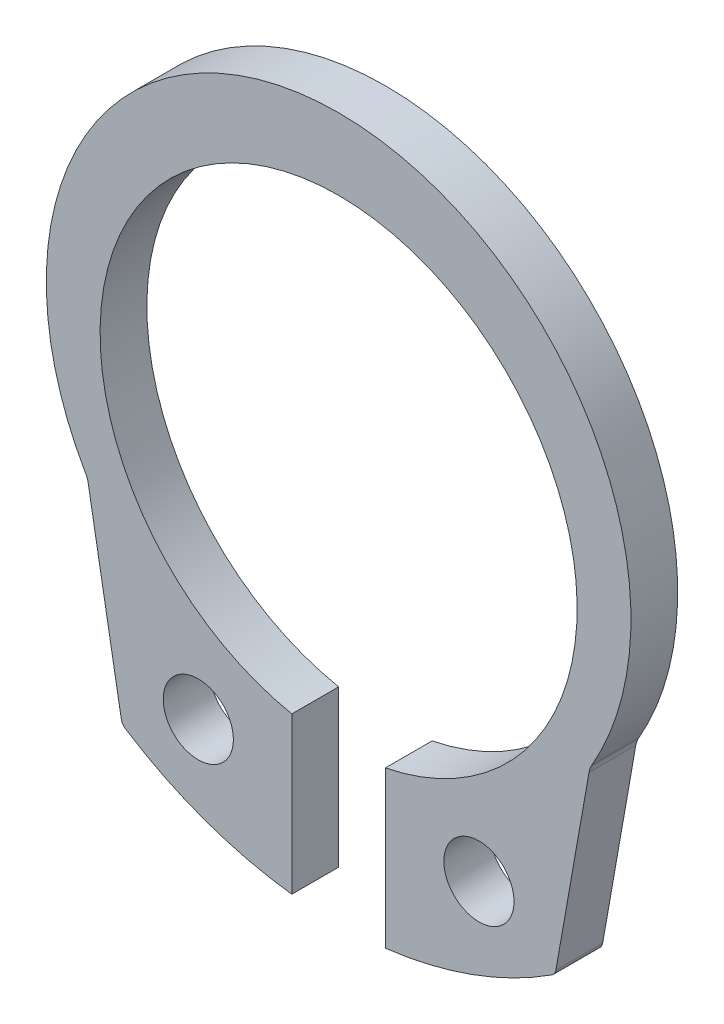
ISO-10303-21;
HEADER;
FILE_DESCRIPTION(('STEP AP214'),'2;1');
FILE_NAME('part.step','',(''),(''),'','','');
FILE_SCHEMA(('AUTOMOTIVE_DESIGN { 1 0 10303 214 1 1 1 1 }'));
ENDSEC;
DATA;
#1=APPLICATION_CONTEXT('core data for automotive mechanical design processes');
#2=APPLICATION_PROTOCOL_DEFINITION('international standard','automotive_design',2000,#1);
#3=PRODUCT_CONTEXT('',#1,'mechanical');
#4=PRODUCT('Part','Part','',(#3));
#5=PRODUCT_RELATED_PRODUCT_CATEGORY('part','',(#4));
#6=PRODUCT_DEFINITION_FORMATION('','',#4);
#7=PRODUCT_DEFINITION_CONTEXT('part definition',#1,'design');
#8=PRODUCT_DEFINITION('design','',#6,#7);
#9=PRODUCT_DEFINITION_SHAPE('','',#8);
#10=(LENGTH_UNIT() NAMED_UNIT(*) SI_UNIT(.MILLI.,.METRE.));
#11=(NAMED_UNIT(*) PLANE_ANGLE_UNIT() SI_UNIT($,.RADIAN.));
#12=(NAMED_UNIT(*) SI_UNIT($,.STERADIAN.) SOLID_ANGLE_UNIT());
#13=UNCERTAINTY_MEASURE_WITH_UNIT(LENGTH_MEASURE(1.E-05),#10,'distance_accuracy_value','');
#14=(GEOMETRIC_REPRESENTATION_CONTEXT(3) GLOBAL_UNCERTAINTY_ASSIGNED_CONTEXT((#13)) GLOBAL_UNIT_ASSIGNED_CONTEXT((#10,
#11,#12)) REPRESENTATION_CONTEXT('',''));
#15=CARTESIAN_POINT('',(0.,0.,0.));
#16=DIRECTION('',(0.,0.,1.));
#17=DIRECTION('',(1.,0.,0.));
#18=AXIS2_PLACEMENT_3D('',#15,#16,#17);
#19=CARTESIAN_POINT('',(0.,-0.38,-1.));
#20=DIRECTION('',(0.,0.,1.));
#21=DIRECTION('',(1.,0.,0.));
#22=AXIS2_PLACEMENT_3D('',#19,#20,#21);
#23=CYLINDRICAL_SURFACE('',#22,8.4);
#24=CARTESIAN_POINT('',(0.,-0.38,-1.));
#25=DIRECTION('',(0.,0.,1.));
#26=DIRECTION('',(-1.,0.,0.));
#27=AXIS2_PLACEMENT_3D('',#24,#25,#26);
#28=CIRCLE('',#27,8.4);
#29=CARTESIAN_POINT('',(1.,-8.72026378479722,-1.));
#30=VERTEX_POINT('',#29);
#31=CARTESIAN_POINT('',(4.55722248296453,-7.43632505209069,-1.));
#32=VERTEX_POINT('',#31);
#33=EDGE_CURVE('E174',#30,#32,#28,.T.);
#34=ORIENTED_EDGE('',*,*,#33,.T.);
#35=DIRECTION('',(0.,0.,1.));
#36=VECTOR('',#35,1.);
#37=CARTESIAN_POINT('',(4.55722248296453,-7.43632505209069,-1.));
#38=LINE('',#37,#36);
#39=CARTESIAN_POINT('',(4.55722248296453,-7.43632505209069,0.));
#40=VERTEX_POINT('',#39);
#41=EDGE_CURVE('E192',#32,#40,#38,.T.);
#42=ORIENTED_EDGE('',*,*,#41,.T.);
#43=CARTESIAN_POINT('',(0.,-0.38,0.));
#44=DIRECTION('',(0.,0.,1.));
#45=DIRECTION('',(-1.,0.,0.));
#46=AXIS2_PLACEMENT_3D('',#43,#44,#45);
#47=CIRCLE('',#46,8.4);
#48=CARTESIAN_POINT('',(1.,-8.72026378479722,0.));
#49=VERTEX_POINT('',#48);
#50=EDGE_CURVE('E154',#49,#40,#47,.T.);
#51=ORIENTED_EDGE('',*,*,#50,.F.);
#52=DIRECTION('',(0.,0.,1.));
#53=VECTOR('',#52,1.);
#54=CARTESIAN_POINT('',(1.,-8.72026378479722,-1.));
#55=LINE('',#54,#53);
#56=EDGE_CURVE('E175',#30,#49,#55,.T.);
#57=ORIENTED_EDGE('',*,*,#56,.F.);
#58=EDGE_LOOP('',(#34,#42,#51,#57));
#59=FACE_BOUND('',#58,.T.);
#60=ADVANCED_FACE('F33',(#59),#23,.T.);
#61=CARTESIAN_POINT('',(1.,-5.38099990001999,-1.));
#62=DIRECTION('',(-1.,0.,0.));
#63=DIRECTION('',(0.,-1.,0.));
#64=AXIS2_PLACEMENT_3D('',#61,#62,#63);
#65=PLANE('',#64);
#66=DIRECTION('',(0.,-1.,0.));
#67=VECTOR('',#66,1.);
#68=CARTESIAN_POINT('',(1.,-5.38099990001999,0.));
#69=LINE('',#68,#67);
#70=CARTESIAN_POINT('',(1.,-5.38099990001999,0.));
#71=VERTEX_POINT('',#70);
#72=EDGE_CURVE('E171',#71,#49,#69,.T.);
#73=ORIENTED_EDGE('',*,*,#72,.F.);
#74=DIRECTION('',(0.,0.,1.));
#75=VECTOR('',#74,1.);
#76=CARTESIAN_POINT('',(1.,-5.38099990001999,-1.));
#77=LINE('',#76,#75);
#78=CARTESIAN_POINT('',(1.,-5.38099990001999,-1.));
#79=VERTEX_POINT('',#78);
#80=EDGE_CURVE('E178',#79,#71,#77,.T.);
#81=ORIENTED_EDGE('',*,*,#80,.F.);
#82=DIRECTION('',(0.,-1.,0.));
#83=VECTOR('',#82,1.);
#84=CARTESIAN_POINT('',(1.,-5.38099990001999,-1.));
#85=LINE('',#84,#83);
#86=EDGE_CURVE('E141',#79,#30,#85,.T.);
#87=ORIENTED_EDGE('',*,*,#86,.T.);
#88=ORIENTED_EDGE('',*,*,#56,.T.);
#89=EDGE_LOOP('',(#73,#81,#87,#88));
#90=FACE_BOUND('',#89,.T.);
#91=ADVANCED_FACE('F273',(#90),#65,.T.);
#92=CARTESIAN_POINT('',(0.,-0.38,-1.));
#93=DIRECTION('',(0.,0.,1.));
#94=DIRECTION('',(1.,0.,0.));
#95=AXIS2_PLACEMENT_3D('',#92,#93,#94);
#96=CYLINDRICAL_SURFACE('',#95,5.1);
#97=CARTESIAN_POINT('',(0.,-0.38,0.));
#98=DIRECTION('',(0.,0.,-1.));
#99=DIRECTION('',(1.,0.,0.));
#100=AXIS2_PLACEMENT_3D('',#97,#98,#99);
#101=CIRCLE('',#100,5.1);
#102=CARTESIAN_POINT('',(-1.,-5.38099990001999,0.));
#103=VERTEX_POINT('',#102);
#104=EDGE_CURVE('E168',#103,#71,#101,.T.);
#105=ORIENTED_EDGE('',*,*,#104,.F.);
#106=DIRECTION('',(0.,0.,1.));
#107=VECTOR('',#106,1.);
#108=CARTESIAN_POINT('',(-1.,-5.38099990001999,-1.));
#109=LINE('',#108,#107);
#110=CARTESIAN_POINT('',(-1.,-5.38099990001999,-1.));
#111=VERTEX_POINT('',#110);
#112=EDGE_CURVE('E140',#111,#103,#109,.T.);
#113=ORIENTED_EDGE('',*,*,#112,.F.);
#114=CARTESIAN_POINT('',(0.,-0.38,-1.));
#115=DIRECTION('',(0.,0.,-1.));
#116=DIRECTION('',(1.,0.,0.));
#117=AXIS2_PLACEMENT_3D('',#114,#115,#116);
#118=CIRCLE('',#117,5.1);
#119=EDGE_CURVE('E147',#111,#79,#118,.T.);
#120=ORIENTED_EDGE('',*,*,#119,.T.);
#121=ORIENTED_EDGE('',*,*,#80,.T.);
#122=EDGE_LOOP('',(#105,#113,#120,#121));
#123=FACE_BOUND('',#122,.T.);
#124=ADVANCED_FACE('F279',(#123),#96,.F.);
#125=CARTESIAN_POINT('',(-1.,-5.38099990001999,-1.));
#126=DIRECTION('',(1.,0.,0.));
#127=DIRECTION('',(0.,1.,0.));
#128=AXIS2_PLACEMENT_3D('',#125,#126,#127);
#129=PLANE('',#128);
#130=DIRECTION('',(0.,1.,0.));
#131=VECTOR('',#130,1.);
#132=CARTESIAN_POINT('',(-1.,-5.38099990001999,0.));
#133=LINE('',#132,#131);
#134=CARTESIAN_POINT('',(-1.,-8.72026378479722,0.));
#135=VERTEX_POINT('',#134);
#136=EDGE_CURVE('E139',#135,#103,#133,.T.);
#137=ORIENTED_EDGE('',*,*,#136,.F.);
#138=DIRECTION('',(0.,0.,1.));
#139=VECTOR('',#138,1.);
#140=CARTESIAN_POINT('',(-1.,-8.72026378479722,-1.));
#141=LINE('',#140,#139);
#142=CARTESIAN_POINT('',(-1.,-8.72026378479722,-1.));
#143=VERTEX_POINT('',#142);
#144=EDGE_CURVE('E124',#143,#135,#141,.T.);
#145=ORIENTED_EDGE('',*,*,#144,.F.);
#146=DIRECTION('',(0.,1.,0.));
#147=VECTOR('',#146,1.);
#148=CARTESIAN_POINT('',(-1.,-5.38099990001999,-1.));
#149=LINE('',#148,#147);
#150=EDGE_CURVE('E132',#143,#111,#149,.T.);
#151=ORIENTED_EDGE('',*,*,#150,.T.);
#152=ORIENTED_EDGE('',*,*,#112,.T.);
#153=EDGE_LOOP('',(#137,#145,#151,#152));
#154=FACE_BOUND('',#153,.T.);
#155=ADVANCED_FACE('F137',(#154),#129,.T.);
#156=CARTESIAN_POINT('',(0.,-0.38,-1.));
#157=DIRECTION('',(0.,0.,1.));
#158=DIRECTION('',(1.,0.,0.));
#159=AXIS2_PLACEMENT_3D('',#156,#157,#158);
#160=CYLINDRICAL_SURFACE('',#159,8.4);
#161=CARTESIAN_POINT('',(0.,-0.38,0.));
#162=DIRECTION('',(0.,0.,1.));
#163=DIRECTION('',(1.,0.,0.));
#164=AXIS2_PLACEMENT_3D('',#161,#162,#163);
#165=CIRCLE('',#164,8.4);
#166=CARTESIAN_POINT('',(-4.55722248296453,-7.43632505209069,0.));
#167=VERTEX_POINT('',#166);
#168=EDGE_CURVE('E165',#167,#135,#165,.T.);
#169=ORIENTED_EDGE('',*,*,#168,.F.);
#170=DIRECTION('',(0.,0.,1.));
#171=VECTOR('',#170,1.);
#172=CARTESIAN_POINT('',(-4.55722248296453,-7.43632505209069,-1.));
#173=LINE('',#172,#171);
#174=CARTESIAN_POINT('',(-4.55722248296453,-7.43632505209069,-1.));
#175=VERTEX_POINT('',#174);
#176=EDGE_CURVE('E127',#167,#175,#173,.F.);
#177=ORIENTED_EDGE('',*,*,#176,.T.);
#178=CARTESIAN_POINT('',(0.,-0.38,-1.));
#179=DIRECTION('',(0.,0.,1.));
#180=DIRECTION('',(1.,0.,0.));
#181=AXIS2_PLACEMENT_3D('',#178,#179,#180);
#182=CIRCLE('',#181,8.4);
#183=EDGE_CURVE('E120',#175,#143,#182,.T.);
#184=ORIENTED_EDGE('',*,*,#183,.T.);
#185=ORIENTED_EDGE('',*,*,#144,.T.);
#186=EDGE_LOOP('',(#169,#177,#184,#185));
#187=FACE_BOUND('',#186,.T.);
#188=ADVANCED_FACE('F123',(#187),#160,.T.);
#189=CARTESIAN_POINT('',(-5.36936571907662,-3.19881412007713,-1.));
#190=DIRECTION('',(-0.984807753012208,-0.173648177666931,0.));
#191=DIRECTION('',(0.173648177666931,-0.984807753012208,0.));
#192=AXIS2_PLACEMENT_3D('',#189,#190,#191);
#193=PLANE('',#192);
#194=DIRECTION('',(0.173648177666931,-0.984807753012208,0.));
#195=VECTOR('',#194,1.);
#196=CARTESIAN_POINT('',(-5.36936571907662,-3.19881412007713,0.));
#197=LINE('',#196,#195);
#198=CARTESIAN_POINT('',(-5.3537588947958,-3.28732481888292,0.));
#199=VERTEX_POINT('',#198);
#200=CARTESIAN_POINT('',(-4.64567873635353,-7.30304694828858,0.));
#201=VERTEX_POINT('',#200);
#202=EDGE_CURVE('E163',#199,#201,#197,.T.);
#203=ORIENTED_EDGE('',*,*,#202,.F.);
#204=DIRECTION('',(0.,0.,-1.));
#205=VECTOR('',#204,1.);
#206=CARTESIAN_POINT('',(-5.3537588947958,-3.28732481888292,-1.));
#207=LINE('',#206,#205);
#208=CARTESIAN_POINT('',(-5.3537588947958,-3.28732481888292,-1.));
#209=VERTEX_POINT('',#208);
#210=EDGE_CURVE('E54',#199,#209,#207,.T.);
#211=ORIENTED_EDGE('',*,*,#210,.T.);
#212=DIRECTION('',(0.173648177666931,-0.984807753012208,0.));
#213=VECTOR('',#212,1.);
#214=CARTESIAN_POINT('',(-5.36936571907662,-3.19881412007713,-1.));
#215=LINE('',#214,#213);
#216=CARTESIAN_POINT('',(-4.64567873635353,-7.30304694828858,-1.));
#217=VERTEX_POINT('',#216);
#218=EDGE_CURVE('E133',#209,#217,#215,.T.);
#219=ORIENTED_EDGE('',*,*,#218,.T.);
#220=DIRECTION('',(0.,0.,1.));
#221=VECTOR('',#220,1.);
#222=CARTESIAN_POINT('',(-4.64567873635353,-7.30304694828858,-1.));
#223=LINE('',#222,#221);
#224=EDGE_CURVE('E177',#217,#201,#223,.T.);
#225=ORIENTED_EDGE('',*,*,#224,.T.);
#226=EDGE_LOOP('',(#203,#211,#219,#225));
#227=FACE_BOUND('',#226,.T.);
#228=ADVANCED_FACE('F332',(#227),#193,.T.);
#229=CARTESIAN_POINT('',(0.,0.,-1.));
#230=DIRECTION('',(0.,0.,1.));
#231=DIRECTION('',(1.,0.,0.));
#232=AXIS2_PLACEMENT_3D('',#229,#230,#231);
#233=CYLINDRICAL_SURFACE('',#232,6.25);
#234=CARTESIAN_POINT('',(0.,0.,0.));
#235=DIRECTION('',(0.,0.,1.));
#236=DIRECTION('',(1.,0.,0.));
#237=AXIS2_PLACEMENT_3D('',#234,#235,#236);
#238=CIRCLE('',#237,6.25);
#239=CARTESIAN_POINT('',(5.41311367713139,-3.12421195158925,0.));
#240=VERTEX_POINT('',#239);
#241=CARTESIAN_POINT('',(-5.41311367713139,-3.12421195158925,0.));
#242=VERTEX_POINT('',#241);
#243=EDGE_CURVE('E161',#240,#242,#238,.T.);
#244=ORIENTED_EDGE('',*,*,#243,.F.);
#245=DIRECTION('',(0.,0.,1.));
#246=VECTOR('',#245,1.);
#247=CARTESIAN_POINT('',(5.41311367713139,-3.12421195158925,-1.));
#248=LINE('',#247,#246);
#249=CARTESIAN_POINT('',(5.41311367713139,-3.12421195158925,-1.));
#250=VERTEX_POINT('',#249);
#251=EDGE_CURVE('E203',#240,#250,#248,.F.);
#252=ORIENTED_EDGE('',*,*,#251,.T.);
#253=CARTESIAN_POINT('',(0.,0.,-1.));
#254=DIRECTION('',(0.,0.,1.));
#255=DIRECTION('',(1.,0.,0.));
#256=AXIS2_PLACEMENT_3D('',#253,#254,#255);
#257=CIRCLE('',#256,6.25);
#258=CARTESIAN_POINT('',(-5.41311367713139,-3.12421195158925,-1.));
#259=VERTEX_POINT('',#258);
#260=EDGE_CURVE('E216',#250,#259,#257,.T.);
#261=ORIENTED_EDGE('',*,*,#260,.T.);
#262=DIRECTION('',(0.,0.,1.));
#263=VECTOR('',#262,1.);
#264=CARTESIAN_POINT('',(-5.41311367713139,-3.12421195158925,-1.));
#265=LINE('',#264,#263);
#266=EDGE_CURVE('E200',#259,#242,#265,.T.);
#267=ORIENTED_EDGE('',*,*,#266,.T.);
#268=EDGE_LOOP('',(#244,#252,#261,#267));
#269=FACE_BOUND('',#268,.T.);
#270=ADVANCED_FACE('F229',(#269),#233,.T.);
#271=CARTESIAN_POINT('',(5.36936571907662,-3.19881412007713,-1.));
#272=DIRECTION('',(0.984807753012208,-0.173648177666931,0.));
#273=DIRECTION('',(0.173648177666931,0.984807753012208,0.));
#274=AXIS2_PLACEMENT_3D('',#271,#272,#273);
#275=PLANE('',#274);
#276=DIRECTION('',(0.173648177666931,0.984807753012208,0.));
#277=VECTOR('',#276,1.);
#278=CARTESIAN_POINT('',(5.36936571907662,-3.19881412007713,-1.));
#279=LINE('',#278,#277);
#280=CARTESIAN_POINT('',(4.64567873635353,-7.30304694828858,-1.));
#281=VERTEX_POINT('',#280);
#282=CARTESIAN_POINT('',(5.3537588947958,-3.28732481888292,-1.));
#283=VERTEX_POINT('',#282);
#284=EDGE_CURVE('E213',#281,#283,#279,.T.);
#285=ORIENTED_EDGE('',*,*,#284,.T.);
#286=DIRECTION('',(0.,0.,-1.));
#287=VECTOR('',#286,1.);
#288=CARTESIAN_POINT('',(5.3537588947958,-3.28732481888292,0.));
#289=LINE('',#288,#287);
#290=CARTESIAN_POINT('',(5.3537588947958,-3.28732481888292,0.));
#291=VERTEX_POINT('',#290);
#292=EDGE_CURVE('E197',#283,#291,#289,.F.);
#293=ORIENTED_EDGE('',*,*,#292,.T.);
#294=DIRECTION('',(0.173648177666931,0.984807753012208,0.));
#295=VECTOR('',#294,1.);
#296=CARTESIAN_POINT('',(5.36936571907662,-3.19881412007713,0.));
#297=LINE('',#296,#295);
#298=CARTESIAN_POINT('',(4.64567873635353,-7.30304694828858,0.));
#299=VERTEX_POINT('',#298);
#300=EDGE_CURVE('E157',#299,#291,#297,.T.);
#301=ORIENTED_EDGE('',*,*,#300,.F.);
#302=DIRECTION('',(0.,0.,1.));
#303=VECTOR('',#302,1.);
#304=CARTESIAN_POINT('',(4.64567873635353,-7.30304694828858,-1.));
#305=LINE('',#304,#303);
#306=EDGE_CURVE('E195',#299,#281,#305,.F.);
#307=ORIENTED_EDGE('',*,*,#306,.T.);
#308=EDGE_LOOP('',(#285,#293,#301,#307));
#309=FACE_BOUND('',#308,.T.);
#310=ADVANCED_FACE('F221',(#309),#275,.T.);
#311=CARTESIAN_POINT('',(0.,-0.38,-1.));
#312=DIRECTION('',(0.,0.,-1.));
#313=DIRECTION('',(-1.,0.,0.));
#314=AXIS2_PLACEMENT_3D('',#311,#312,#313);
#315=PLANE('',#314);
#316=CARTESIAN_POINT('',(3.,-6.48245852095694,-1.));
#317=DIRECTION('',(0.,0.,1.));
#318=DIRECTION('',(-1.,0.,0.));
#319=AXIS2_PLACEMENT_3D('',#316,#317,#318);
#320=CIRCLE('',#319,0.75);
#321=CARTESIAN_POINT('',(2.25,-6.48245852095694,-1.));
#322=VERTEX_POINT('',#321);
#323=EDGE_CURVE('E241',#322,#322,#320,.T.);
#324=ORIENTED_EDGE('',*,*,#323,.T.);
#325=EDGE_LOOP('',(#324));
#326=FACE_BOUND('',#325,.T.);
#327=CARTESIAN_POINT('',(-3.,-6.48245852095694,-1.));
#328=DIRECTION('',(0.,0.,1.));
#329=DIRECTION('',(1.,0.,0.));
#330=AXIS2_PLACEMENT_3D('',#327,#328,#329);
#331=CIRCLE('',#330,0.75);
#332=CARTESIAN_POINT('',(-2.25,-6.48245852095694,-1.));
#333=VERTEX_POINT('',#332);
#334=EDGE_CURVE('E158',#333,#333,#331,.T.);
#335=ORIENTED_EDGE('',*,*,#334,.T.);
#336=EDGE_LOOP('',(#335));
#337=FACE_BOUND('',#336,.T.);
#338=ORIENTED_EDGE('',*,*,#183,.F.);
#339=CARTESIAN_POINT('',(-4.44871718575109,-7.2683173127552,-1.));
#340=DIRECTION('',(0.,0.,-1.));
#341=DIRECTION('',(-1.,0.,0.));
#342=AXIS2_PLACEMENT_3D('',#339,#340,#341);
#343=CIRCLE('',#342,0.2);
#344=EDGE_CURVE('E190',#175,#217,#343,.T.);
#345=ORIENTED_EDGE('',*,*,#344,.T.);
#346=ORIENTED_EDGE('',*,*,#218,.F.);
#347=CARTESIAN_POINT('',(-5.8461627713019,-3.37414890771639,-1.));
#348=DIRECTION('',(0.,0.,-1.));
#349=DIRECTION('',(-1.,0.,0.));
#350=AXIS2_PLACEMENT_3D('',#347,#348,#349);
#351=CIRCLE('',#350,0.5);
#352=EDGE_CURVE('E11',#209,#259,#351,.F.);
#353=ORIENTED_EDGE('',*,*,#352,.T.);
#354=ORIENTED_EDGE('',*,*,#260,.F.);
#355=CARTESIAN_POINT('',(5.8461627713019,-3.37414890771639,-1.));
#356=DIRECTION('',(0.,0.,-1.));
#357=DIRECTION('',(-1.,0.,0.));
#358=AXIS2_PLACEMENT_3D('',#355,#356,#357);
#359=CIRCLE('',#358,0.5);
#360=EDGE_CURVE('E208',#250,#283,#359,.F.);
#361=ORIENTED_EDGE('',*,*,#360,.T.);
#362=ORIENTED_EDGE('',*,*,#284,.F.);
#363=CARTESIAN_POINT('',(4.44871718575109,-7.2683173127552,-1.));
#364=DIRECTION('',(0.,0.,-1.));
#365=DIRECTION('',(-1.,0.,0.));
#366=AXIS2_PLACEMENT_3D('',#363,#364,#365);
#367=CIRCLE('',#366,0.2);
#368=EDGE_CURVE('E188',#281,#32,#367,.T.);
#369=ORIENTED_EDGE('',*,*,#368,.T.);
#370=ORIENTED_EDGE('',*,*,#33,.F.);
#371=ORIENTED_EDGE('',*,*,#86,.F.);
#372=ORIENTED_EDGE('',*,*,#119,.F.);
#373=ORIENTED_EDGE('',*,*,#150,.F.);
#374=EDGE_LOOP('',(#338,#345,#346,#353,#354,#361,#362,#369,#370,#371,#372,#373));
#375=FACE_BOUND('',#374,.T.);
#376=ADVANCED_FACE('F144',(#326,#337,#375),#315,.T.);
#377=CARTESIAN_POINT('',(0.,-0.38,0.));
#378=DIRECTION('',(0.,0.,-1.));
#379=DIRECTION('',(-1.,0.,0.));
#380=AXIS2_PLACEMENT_3D('',#377,#378,#379);
#381=PLANE('',#380);
#382=CARTESIAN_POINT('',(3.,-6.48245852095694,0.));
#383=DIRECTION('',(0.,0.,1.));
#384=DIRECTION('',(-1.,0.,0.));
#385=AXIS2_PLACEMENT_3D('',#382,#383,#384);
#386=CIRCLE('',#385,0.75);
#387=CARTESIAN_POINT('',(2.25,-6.48245852095694,0.));
#388=VERTEX_POINT('',#387);
#389=EDGE_CURVE('E244',#388,#388,#386,.T.);
#390=ORIENTED_EDGE('',*,*,#389,.F.);
#391=EDGE_LOOP('',(#390));
#392=FACE_BOUND('',#391,.T.);
#393=CARTESIAN_POINT('',(-3.,-6.48245852095694,0.));
#394=DIRECTION('',(0.,0.,1.));
#395=DIRECTION('',(1.,0.,0.));
#396=AXIS2_PLACEMENT_3D('',#393,#394,#395);
#397=CIRCLE('',#396,0.75);
#398=CARTESIAN_POINT('',(-2.25,-6.48245852095694,0.));
#399=VERTEX_POINT('',#398);
#400=EDGE_CURVE('E238',#399,#399,#397,.T.);
#401=ORIENTED_EDGE('',*,*,#400,.F.);
#402=EDGE_LOOP('',(#401));
#403=FACE_BOUND('',#402,.T.);
#404=ORIENTED_EDGE('',*,*,#243,.T.);
#405=CARTESIAN_POINT('',(-5.8461627713019,-3.37414890771639,0.));
#406=DIRECTION('',(0.,0.,-1.));
#407=DIRECTION('',(-1.,0.,0.));
#408=AXIS2_PLACEMENT_3D('',#405,#406,#407);
#409=CIRCLE('',#408,0.5);
#410=EDGE_CURVE('E41',#242,#199,#409,.T.);
#411=ORIENTED_EDGE('',*,*,#410,.T.);
#412=ORIENTED_EDGE('',*,*,#202,.T.);
#413=CARTESIAN_POINT('',(-4.44871718575109,-7.2683173127552,0.));
#414=DIRECTION('',(0.,0.,-1.));
#415=DIRECTION('',(-1.,0.,0.));
#416=AXIS2_PLACEMENT_3D('',#413,#414,#415);
#417=CIRCLE('',#416,0.2);
#418=EDGE_CURVE('E185',#201,#167,#417,.F.);
#419=ORIENTED_EDGE('',*,*,#418,.T.);
#420=ORIENTED_EDGE('',*,*,#168,.T.);
#421=ORIENTED_EDGE('',*,*,#136,.T.);
#422=ORIENTED_EDGE('',*,*,#104,.T.);
#423=ORIENTED_EDGE('',*,*,#72,.T.);
#424=ORIENTED_EDGE('',*,*,#50,.T.);
#425=CARTESIAN_POINT('',(4.44871718575109,-7.2683173127552,0.));
#426=DIRECTION('',(0.,0.,-1.));
#427=DIRECTION('',(-1.,0.,0.));
#428=AXIS2_PLACEMENT_3D('',#425,#426,#427);
#429=CIRCLE('',#428,0.2);
#430=EDGE_CURVE('E183',#40,#299,#429,.F.);
#431=ORIENTED_EDGE('',*,*,#430,.T.);
#432=ORIENTED_EDGE('',*,*,#300,.T.);
#433=CARTESIAN_POINT('',(5.8461627713019,-3.37414890771639,0.));
#434=DIRECTION('',(0.,0.,-1.));
#435=DIRECTION('',(-1.,0.,0.));
#436=AXIS2_PLACEMENT_3D('',#433,#434,#435);
#437=CIRCLE('',#436,0.5);
#438=EDGE_CURVE('E206',#291,#240,#437,.T.);
#439=ORIENTED_EDGE('',*,*,#438,.T.);
#440=EDGE_LOOP('',(#404,#411,#412,#419,#420,#421,#422,#423,#424,#431,#432,#439));
#441=FACE_BOUND('',#440,.T.);
#442=ADVANCED_FACE('F227',(#392,#403,#441),#381,.F.);
#443=CARTESIAN_POINT('',(-3.,-6.48245852095694,-1.));
#444=DIRECTION('',(0.,0.,1.));
#445=DIRECTION('',(1.,0.,0.));
#446=AXIS2_PLACEMENT_3D('',#443,#444,#445);
#447=CYLINDRICAL_SURFACE('',#446,0.75);
#448=ORIENTED_EDGE('',*,*,#334,.F.);
#449=EDGE_LOOP('',(#448));
#450=FACE_BOUND('',#449,.T.);
#451=ORIENTED_EDGE('',*,*,#400,.T.);
#452=EDGE_LOOP('',(#451));
#453=FACE_BOUND('',#452,.T.);
#454=ADVANCED_FACE('F256',(#450,#453),#447,.F.);
#455=CARTESIAN_POINT('',(3.,-6.48245852095694,-1.));
#456=DIRECTION('',(0.,0.,1.));
#457=DIRECTION('',(1.,0.,0.));
#458=AXIS2_PLACEMENT_3D('',#455,#456,#457);
#459=CYLINDRICAL_SURFACE('',#458,0.75);
#460=ORIENTED_EDGE('',*,*,#323,.F.);
#461=EDGE_LOOP('',(#460));
#462=FACE_BOUND('',#461,.T.);
#463=ORIENTED_EDGE('',*,*,#389,.T.);
#464=EDGE_LOOP('',(#463));
#465=FACE_BOUND('',#464,.T.);
#466=ADVANCED_FACE('F252',(#462,#465),#459,.F.);
#467=CARTESIAN_POINT('',(-4.44871718575109,-7.2683173127552,-1.));
#468=DIRECTION('',(0.,0.,1.));
#469=DIRECTION('',(1.,0.,0.));
#470=AXIS2_PLACEMENT_3D('',#467,#468,#469);
#471=CYLINDRICAL_SURFACE('',#470,0.2);
#472=ORIENTED_EDGE('',*,*,#344,.F.);
#473=ORIENTED_EDGE('',*,*,#176,.F.);
#474=ORIENTED_EDGE('',*,*,#418,.F.);
#475=ORIENTED_EDGE('',*,*,#224,.F.);
#476=EDGE_LOOP('',(#472,#473,#474,#475));
#477=FACE_BOUND('',#476,.T.);
#478=ADVANCED_FACE('F255',(#477),#471,.T.);
#479=CARTESIAN_POINT('',(4.44871718575109,-7.2683173127552,-1.));
#480=DIRECTION('',(0.,0.,1.));
#481=DIRECTION('',(1.,0.,0.));
#482=AXIS2_PLACEMENT_3D('',#479,#480,#481);
#483=CYLINDRICAL_SURFACE('',#482,0.2);
#484=ORIENTED_EDGE('',*,*,#368,.F.);
#485=ORIENTED_EDGE('',*,*,#306,.F.);
#486=ORIENTED_EDGE('',*,*,#430,.F.);
#487=ORIENTED_EDGE('',*,*,#41,.F.);
#488=EDGE_LOOP('',(#484,#485,#486,#487));
#489=FACE_BOUND('',#488,.T.);
#490=ADVANCED_FACE('F287',(#489),#483,.T.);
#491=CARTESIAN_POINT('',(5.8461627713019,-3.37414890771639,-1.));
#492=DIRECTION('',(0.,0.,1.));
#493=DIRECTION('',(1.,0.,0.));
#494=AXIS2_PLACEMENT_3D('',#491,#492,#493);
#495=CYLINDRICAL_SURFACE('',#494,0.5);
#496=ORIENTED_EDGE('',*,*,#360,.F.);
#497=ORIENTED_EDGE('',*,*,#251,.F.);
#498=ORIENTED_EDGE('',*,*,#438,.F.);
#499=ORIENTED_EDGE('',*,*,#292,.F.);
#500=EDGE_LOOP('',(#496,#497,#498,#499));
#501=FACE_BOUND('',#500,.T.);
#502=ADVANCED_FACE('F225',(#501),#495,.F.);
#503=CARTESIAN_POINT('',(-5.8461627713019,-3.37414890771639,-1.));
#504=DIRECTION('',(0.,0.,1.));
#505=DIRECTION('',(1.,0.,0.));
#506=AXIS2_PLACEMENT_3D('',#503,#504,#505);
#507=CYLINDRICAL_SURFACE('',#506,0.5);
#508=ORIENTED_EDGE('',*,*,#352,.F.);
#509=ORIENTED_EDGE('',*,*,#210,.F.);
#510=ORIENTED_EDGE('',*,*,#410,.F.);
#511=ORIENTED_EDGE('',*,*,#266,.F.);
#512=EDGE_LOOP('',(#508,#509,#510,#511));
#513=FACE_BOUND('',#512,.T.);
#514=ADVANCED_FACE('F35',(#513),#507,.F.);
#515=CLOSED_SHELL('',(#60,#91,#124,#155,#188,#228,#270,#310,#376,#442,#454,#466,#478,#490,#502,#514));
#516=MANIFOLD_SOLID_BREP('B2',#515);
#517=ADVANCED_BREP_SHAPE_REPRESENTATION('',(#18,#516),#14);
#518=SHAPE_DEFINITION_REPRESENTATION(#9,#517);
ENDSEC;
END-ISO-10303-21;
